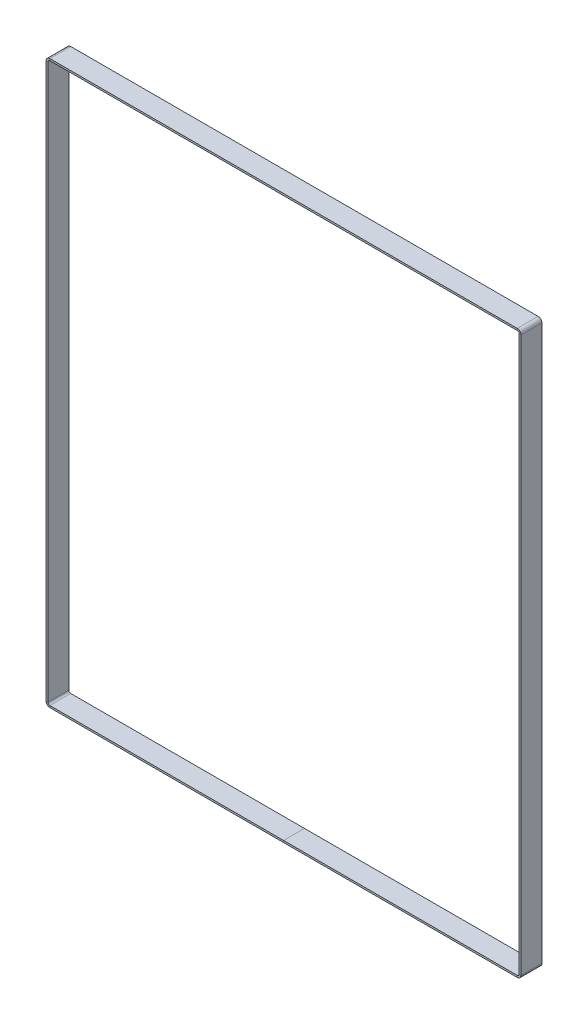
ISO-10303-21;
HEADER;
FILE_DESCRIPTION(('STEP AP214'),'2;1');
FILE_NAME('part.step','',(''),(''),'','','');
FILE_SCHEMA(('AUTOMOTIVE_DESIGN { 1 0 10303 214 1 1 1 1 }'));
ENDSEC;
DATA;
#1=APPLICATION_CONTEXT('core data for automotive mechanical design processes');
#2=APPLICATION_PROTOCOL_DEFINITION('international standard','automotive_design',2000,#1);
#3=PRODUCT_CONTEXT('',#1,'mechanical');
#4=PRODUCT('Part','Part','',(#3));
#5=PRODUCT_RELATED_PRODUCT_CATEGORY('part','',(#4));
#6=PRODUCT_DEFINITION_FORMATION('','',#4);
#7=PRODUCT_DEFINITION_CONTEXT('part definition',#1,'design');
#8=PRODUCT_DEFINITION('design','',#6,#7);
#9=PRODUCT_DEFINITION_SHAPE('','',#8);
#10=(LENGTH_UNIT() NAMED_UNIT(*) SI_UNIT(.MILLI.,.METRE.));
#11=(NAMED_UNIT(*) PLANE_ANGLE_UNIT() SI_UNIT($,.RADIAN.));
#12=(NAMED_UNIT(*) SI_UNIT($,.STERADIAN.) SOLID_ANGLE_UNIT());
#13=UNCERTAINTY_MEASURE_WITH_UNIT(LENGTH_MEASURE(1.E-05),#10,'distance_accuracy_value','');
#14=(GEOMETRIC_REPRESENTATION_CONTEXT(3) GLOBAL_UNCERTAINTY_ASSIGNED_CONTEXT((#13)) GLOBAL_UNIT_ASSIGNED_CONTEXT((#10,
#11,#12)) REPRESENTATION_CONTEXT('',''));
#15=CARTESIAN_POINT('',(0.,0.,0.));
#16=DIRECTION('',(0.,0.,1.));
#17=DIRECTION('',(1.,0.,0.));
#18=AXIS2_PLACEMENT_3D('',#15,#16,#17);
#19=CARTESIAN_POINT('',(118.212754397594,-97.4772081869041,103.673110700388));
#20=DIRECTION('',(0.,0.,-1.));
#21=DIRECTION('',(-1.,0.,0.));
#22=AXIS2_PLACEMENT_3D('',#19,#20,#21);
#23=PLANE('',#22);
#24=DIRECTION('',(1.,0.,0.));
#25=VECTOR('',#24,1.);
#26=CARTESIAN_POINT('',(118.212754397594,-98.1772081869041,103.673110700388));
#27=LINE('',#26,#25);
#28=CARTESIAN_POINT('',(118.212754397594,-98.1772081869041,103.673110700388));
#29=VERTEX_POINT('',#28);
#30=CARTESIAN_POINT('',(297.212754397594,-98.1772081869041,103.673110700388));
#31=VERTEX_POINT('',#30);
#32=EDGE_CURVE('E451',#29,#31,#27,.T.);
#33=ORIENTED_EDGE('',*,*,#32,.T.);
#34=DIRECTION('',(0.,-1.,0.));
#35=VECTOR('',#34,1.);
#36=CARTESIAN_POINT('',(297.212754397594,-97.4772081869041,103.673110700388));
#37=LINE('',#36,#35);
#38=CARTESIAN_POINT('',(297.212754397594,-97.4772081869041,103.673110700388));
#39=VERTEX_POINT('',#38);
#40=EDGE_CURVE('E120',#39,#31,#37,.T.);
#41=ORIENTED_EDGE('',*,*,#40,.F.);
#42=DIRECTION('',(1.,0.,0.));
#43=VECTOR('',#42,1.);
#44=CARTESIAN_POINT('',(118.212754397594,-97.4772081869041,103.673110700388));
#45=LINE('',#44,#43);
#46=CARTESIAN_POINT('',(118.212754397594,-97.4772081869041,103.673110700388));
#47=VERTEX_POINT('',#46);
#48=EDGE_CURVE('E439',#47,#39,#45,.T.);
#49=ORIENTED_EDGE('',*,*,#48,.F.);
#50=DIRECTION('',(0.,-1.,0.));
#51=VECTOR('',#50,1.);
#52=CARTESIAN_POINT('',(118.212754397594,-97.4772081869041,103.673110700388));
#53=LINE('',#52,#51);
#54=EDGE_CURVE('E13',#47,#29,#53,.T.);
#55=ORIENTED_EDGE('',*,*,#54,.T.);
#56=EDGE_LOOP('',(#33,#41,#49,#55));
#57=FACE_BOUND('',#56,.T.);
#58=ADVANCED_FACE('F113',(#57),#23,.F.);
#59=CARTESIAN_POINT('',(118.212754397594,-97.4772081869041,95.6731107003881));
#60=DIRECTION('',(0.,0.,1.));
#61=DIRECTION('',(1.,0.,0.));
#62=AXIS2_PLACEMENT_3D('',#59,#60,#61);
#63=PLANE('',#62);
#64=DIRECTION('',(-1.,0.,0.));
#65=VECTOR('',#64,1.);
#66=CARTESIAN_POINT('',(118.212754397594,-98.1772081869041,95.6731107003881));
#67=LINE('',#66,#65);
#68=CARTESIAN_POINT('',(297.212754397594,-98.1772081869041,95.6731107003881));
#69=VERTEX_POINT('',#68);
#70=CARTESIAN_POINT('',(118.212754397594,-98.1772081869041,95.6731107003881));
#71=VERTEX_POINT('',#70);
#72=EDGE_CURVE('E440',#69,#71,#67,.T.);
#73=ORIENTED_EDGE('',*,*,#72,.T.);
#74=DIRECTION('',(0.,-1.,0.));
#75=VECTOR('',#74,1.);
#76=CARTESIAN_POINT('',(118.212754397594,-97.4772081869041,95.6731107003881));
#77=LINE('',#76,#75);
#78=CARTESIAN_POINT('',(118.212754397594,-97.4772081869041,95.6731107003881));
#79=VERTEX_POINT('',#78);
#80=EDGE_CURVE('E449',#79,#71,#77,.T.);
#81=ORIENTED_EDGE('',*,*,#80,.F.);
#82=DIRECTION('',(-1.,0.,0.));
#83=VECTOR('',#82,1.);
#84=CARTESIAN_POINT('',(118.212754397594,-97.4772081869041,95.6731107003881));
#85=LINE('',#84,#83);
#86=CARTESIAN_POINT('',(297.212754397594,-97.4772081869041,95.6731107003881));
#87=VERTEX_POINT('',#86);
#88=EDGE_CURVE('E446',#87,#79,#85,.T.);
#89=ORIENTED_EDGE('',*,*,#88,.F.);
#90=DIRECTION('',(0.,-1.,0.));
#91=VECTOR('',#90,1.);
#92=CARTESIAN_POINT('',(297.212754397594,-97.4772081869041,95.6731107003881));
#93=LINE('',#92,#91);
#94=EDGE_CURVE('E459',#87,#69,#93,.T.);
#95=ORIENTED_EDGE('',*,*,#94,.T.);
#96=EDGE_LOOP('',(#73,#81,#89,#95));
#97=FACE_BOUND('',#96,.T.);
#98=ADVANCED_FACE('F479',(#97),#63,.F.);
#99=CARTESIAN_POINT('',(118.212754397594,-97.4772081869041,103.673110700388));
#100=DIRECTION('',(0.,1.,0.));
#101=DIRECTION('',(0.,0.,1.));
#102=AXIS2_PLACEMENT_3D('',#99,#100,#101);
#103=PLANE('',#102);
#104=DIRECTION('',(0.,0.,1.));
#105=VECTOR('',#104,1.);
#106=CARTESIAN_POINT('',(118.212754397594,-97.4772081869041,95.6731107003881));
#107=LINE('',#106,#105);
#108=EDGE_CURVE('E436',#79,#47,#107,.T.);
#109=ORIENTED_EDGE('',*,*,#108,.T.);
#110=ORIENTED_EDGE('',*,*,#48,.T.);
#111=DIRECTION('',(0.,0.,-1.));
#112=VECTOR('',#111,1.);
#113=CARTESIAN_POINT('',(297.212754397594,-97.4772081869041,95.6731107003881));
#114=LINE('',#113,#112);
#115=EDGE_CURVE('E443',#39,#87,#114,.T.);
#116=ORIENTED_EDGE('',*,*,#115,.T.);
#117=ORIENTED_EDGE('',*,*,#88,.T.);
#118=EDGE_LOOP('',(#109,#110,#116,#117));
#119=FACE_BOUND('',#118,.T.);
#120=ADVANCED_FACE('F484',(#119),#103,.T.);
#121=CARTESIAN_POINT('',(118.212754397594,-98.1772081869041,103.673110700388));
#122=DIRECTION('',(0.,1.,0.));
#123=DIRECTION('',(0.,0.,1.));
#124=AXIS2_PLACEMENT_3D('',#121,#122,#123);
#125=PLANE('',#124);
#126=DIRECTION('',(0.,0.,1.));
#127=VECTOR('',#126,1.);
#128=CARTESIAN_POINT('',(118.212754397594,-98.1772081869041,95.6731107003881));
#129=LINE('',#128,#127);
#130=EDGE_CURVE('E427',#71,#29,#129,.T.);
#131=ORIENTED_EDGE('',*,*,#130,.F.);
#132=ORIENTED_EDGE('',*,*,#72,.F.);
#133=DIRECTION('',(0.,0.,-1.));
#134=VECTOR('',#133,1.);
#135=CARTESIAN_POINT('',(297.212754397594,-98.1772081869041,95.6731107003881));
#136=LINE('',#135,#134);
#137=EDGE_CURVE('E454',#31,#69,#136,.T.);
#138=ORIENTED_EDGE('',*,*,#137,.F.);
#139=ORIENTED_EDGE('',*,*,#32,.F.);
#140=EDGE_LOOP('',(#131,#132,#138,#139));
#141=FACE_BOUND('',#140,.T.);
#142=ADVANCED_FACE('F476',(#141),#125,.F.);
#143=CARTESIAN_POINT('',(118.212754397594,-98.9138081869041,103.673110700388));
#144=DIRECTION('',(0.,0.,1.));
#145=DIRECTION('',(1.,0.,0.));
#146=AXIS2_PLACEMENT_3D('',#143,#144,#145);
#147=PLANE('',#146);
#148=DIRECTION('',(-1.,0.,0.));
#149=VECTOR('',#148,1.);
#150=CARTESIAN_POINT('',(116.776154397594,-98.9138081869041,103.673110700388));
#151=LINE('',#150,#149);
#152=CARTESIAN_POINT('',(117.476154397594,-98.9138081869041,103.673110700388));
#153=VERTEX_POINT('',#152);
#154=CARTESIAN_POINT('',(116.776154397594,-98.9138081869041,103.673110700388));
#155=VERTEX_POINT('',#154);
#156=EDGE_CURVE('E385',#153,#155,#151,.T.);
#157=ORIENTED_EDGE('',*,*,#156,.F.);
#158=CARTESIAN_POINT('',(118.212754397594,-98.9138081869041,103.673110700388));
#159=DIRECTION('',(0.,0.,-1.));
#160=DIRECTION('',(-1.,0.,0.));
#161=AXIS2_PLACEMENT_3D('',#158,#159,#160);
#162=CIRCLE('',#161,0.736600000000004);
#163=EDGE_CURVE('E431',#29,#153,#162,.F.);
#164=ORIENTED_EDGE('',*,*,#163,.F.);
#165=ORIENTED_EDGE('',*,*,#54,.F.);
#166=CARTESIAN_POINT('',(118.212754397594,-98.9138081869041,103.673110700388));
#167=DIRECTION('',(0.,0.,-1.));
#168=DIRECTION('',(-1.,0.,0.));
#169=AXIS2_PLACEMENT_3D('',#166,#167,#168);
#170=CIRCLE('',#169,1.4366);
#171=EDGE_CURVE('E135',#47,#155,#170,.F.);
#172=ORIENTED_EDGE('',*,*,#171,.T.);
#173=EDGE_LOOP('',(#157,#164,#165,#172));
#174=FACE_BOUND('',#173,.T.);
#175=ADVANCED_FACE('F526',(#174),#147,.T.);
#176=CARTESIAN_POINT('',(118.212754397594,-98.9138081869041,95.6731107003881));
#177=DIRECTION('',(0.,0.,1.));
#178=DIRECTION('',(1.,0.,0.));
#179=AXIS2_PLACEMENT_3D('',#176,#177,#178);
#180=PLANE('',#179);
#181=CARTESIAN_POINT('',(118.212754397594,-98.9138081869041,95.6731107003881));
#182=DIRECTION('',(0.,0.,-1.));
#183=DIRECTION('',(-1.,0.,0.));
#184=AXIS2_PLACEMENT_3D('',#181,#182,#183);
#185=CIRCLE('',#184,0.736600000000004);
#186=CARTESIAN_POINT('',(117.476154397594,-98.9138081869041,95.6731107003881));
#187=VERTEX_POINT('',#186);
#188=EDGE_CURVE('E397',#187,#71,#185,.T.);
#189=ORIENTED_EDGE('',*,*,#188,.F.);
#190=DIRECTION('',(-1.,0.,0.));
#191=VECTOR('',#190,1.);
#192=CARTESIAN_POINT('',(117.476154397594,-98.9138081869041,95.6731107003881));
#193=LINE('',#192,#191);
#194=CARTESIAN_POINT('',(116.776154397594,-98.9138081869041,95.6731107003881));
#195=VERTEX_POINT('',#194);
#196=EDGE_CURVE('E419',#187,#195,#193,.T.);
#197=ORIENTED_EDGE('',*,*,#196,.T.);
#198=CARTESIAN_POINT('',(118.212754397594,-98.9138081869041,95.6731107003881));
#199=DIRECTION('',(0.,0.,-1.));
#200=DIRECTION('',(-1.,0.,0.));
#201=AXIS2_PLACEMENT_3D('',#198,#199,#200);
#202=CIRCLE('',#201,1.4366);
#203=EDGE_CURVE('E428',#195,#79,#202,.T.);
#204=ORIENTED_EDGE('',*,*,#203,.T.);
#205=ORIENTED_EDGE('',*,*,#80,.T.);
#206=EDGE_LOOP('',(#189,#197,#204,#205));
#207=FACE_BOUND('',#206,.T.);
#208=ADVANCED_FACE('F528',(#207),#180,.F.);
#209=CARTESIAN_POINT('',(118.212754397594,-98.9138081869041,95.6731107003881));
#210=DIRECTION('',(0.,0.,-1.));
#211=DIRECTION('',(-1.,0.,0.));
#212=AXIS2_PLACEMENT_3D('',#209,#210,#211);
#213=CYLINDRICAL_SURFACE('',#212,1.4366);
#214=ORIENTED_EDGE('',*,*,#108,.F.);
#215=ORIENTED_EDGE('',*,*,#203,.F.);
#216=DIRECTION('',(0.,0.,-1.));
#217=VECTOR('',#216,1.);
#218=CARTESIAN_POINT('',(116.776154397594,-98.9138081869041,95.6731107003881));
#219=LINE('',#218,#217);
#220=EDGE_CURVE('E416',#155,#195,#219,.T.);
#221=ORIENTED_EDGE('',*,*,#220,.F.);
#222=ORIENTED_EDGE('',*,*,#171,.F.);
#223=EDGE_LOOP('',(#214,#215,#221,#222));
#224=FACE_BOUND('',#223,.T.);
#225=ADVANCED_FACE('F531',(#224),#213,.T.);
#226=CARTESIAN_POINT('',(118.212754397594,-98.9138081869041,95.6731107003881));
#227=DIRECTION('',(0.,0.,-1.));
#228=DIRECTION('',(-1.,0.,0.));
#229=AXIS2_PLACEMENT_3D('',#226,#227,#228);
#230=CYLINDRICAL_SURFACE('',#229,0.736600000000004);
#231=ORIENTED_EDGE('',*,*,#130,.T.);
#232=ORIENTED_EDGE('',*,*,#163,.T.);
#233=DIRECTION('',(0.,0.,1.));
#234=VECTOR('',#233,1.);
#235=CARTESIAN_POINT('',(117.476154397594,-98.9138081869041,103.673110700388));
#236=LINE('',#235,#234);
#237=EDGE_CURVE('E422',#153,#187,#236,.F.);
#238=ORIENTED_EDGE('',*,*,#237,.T.);
#239=ORIENTED_EDGE('',*,*,#188,.T.);
#240=EDGE_LOOP('',(#231,#232,#238,#239));
#241=FACE_BOUND('',#240,.T.);
#242=ADVANCED_FACE('F533',(#241),#230,.F.);
#243=CARTESIAN_POINT('',(116.776154397594,-98.1772081869041,95.6731107003881));
#244=DIRECTION('',(0.,0.,-1.));
#245=DIRECTION('',(-1.,0.,0.));
#246=AXIS2_PLACEMENT_3D('',#243,#244,#245);
#247=PLANE('',#246);
#248=DIRECTION('',(0.,1.,0.));
#249=VECTOR('',#248,1.);
#250=CARTESIAN_POINT('',(116.776154397594,-98.1772081869041,95.6731107003881));
#251=LINE('',#250,#249);
#252=CARTESIAN_POINT('',(116.776154397594,-311.317208186904,95.6731107003881));
#253=VERTEX_POINT('',#252);
#254=EDGE_CURVE('E401',#253,#195,#251,.T.);
#255=ORIENTED_EDGE('',*,*,#254,.T.);
#256=ORIENTED_EDGE('',*,*,#196,.F.);
#257=DIRECTION('',(0.,-1.,0.));
#258=VECTOR('',#257,1.);
#259=CARTESIAN_POINT('',(117.476154397594,-98.1772081869041,95.6731107003881));
#260=LINE('',#259,#258);
#261=CARTESIAN_POINT('',(117.476154397594,-311.317208186904,95.6731107003881));
#262=VERTEX_POINT('',#261);
#263=EDGE_CURVE('E409',#262,#187,#260,.F.);
#264=ORIENTED_EDGE('',*,*,#263,.F.);
#265=DIRECTION('',(1.,0.,0.));
#266=VECTOR('',#265,1.);
#267=CARTESIAN_POINT('',(116.776154397593,-311.317208186904,95.6731107003881));
#268=LINE('',#267,#266);
#269=EDGE_CURVE('E394',#253,#262,#268,.T.);
#270=ORIENTED_EDGE('',*,*,#269,.F.);
#271=EDGE_LOOP('',(#255,#256,#264,#270));
#272=FACE_BOUND('',#271,.T.);
#273=ADVANCED_FACE('F539',(#272),#247,.T.);
#274=CARTESIAN_POINT('',(116.776154397593,-311.317208186904,103.673110700388));
#275=DIRECTION('',(0.,0.,1.));
#276=DIRECTION('',(0.,-1.,0.));
#277=AXIS2_PLACEMENT_3D('',#274,#275,#276);
#278=PLANE('',#277);
#279=DIRECTION('',(0.,1.,0.));
#280=VECTOR('',#279,1.);
#281=CARTESIAN_POINT('',(117.476154397594,-98.1772081869041,103.673110700388));
#282=LINE('',#281,#280);
#283=CARTESIAN_POINT('',(117.476154397594,-311.317208186904,103.673110700388));
#284=VERTEX_POINT('',#283);
#285=EDGE_CURVE('E414',#153,#284,#282,.F.);
#286=ORIENTED_EDGE('',*,*,#285,.F.);
#287=ORIENTED_EDGE('',*,*,#156,.T.);
#288=DIRECTION('',(0.,-1.,0.));
#289=VECTOR('',#288,1.);
#290=CARTESIAN_POINT('',(116.776154397593,-311.317208186904,103.673110700388));
#291=LINE('',#290,#289);
#292=CARTESIAN_POINT('',(116.776154397593,-311.317208186904,103.673110700388));
#293=VERTEX_POINT('',#292);
#294=EDGE_CURVE('E407',#155,#293,#291,.T.);
#295=ORIENTED_EDGE('',*,*,#294,.T.);
#296=DIRECTION('',(1.,0.,0.));
#297=VECTOR('',#296,1.);
#298=CARTESIAN_POINT('',(116.776154397593,-311.317208186904,103.673110700388));
#299=LINE('',#298,#297);
#300=EDGE_CURVE('E398',#293,#284,#299,.T.);
#301=ORIENTED_EDGE('',*,*,#300,.T.);
#302=EDGE_LOOP('',(#286,#287,#295,#301));
#303=FACE_BOUND('',#302,.T.);
#304=ADVANCED_FACE('F543',(#303),#278,.T.);
#305=CARTESIAN_POINT('',(116.776154397594,-98.1772081869041,95.6731107003881));
#306=DIRECTION('',(-1.,0.,0.));
#307=DIRECTION('',(0.,-1.,0.));
#308=AXIS2_PLACEMENT_3D('',#305,#306,#307);
#309=PLANE('',#308);
#310=ORIENTED_EDGE('',*,*,#294,.F.);
#311=ORIENTED_EDGE('',*,*,#220,.T.);
#312=ORIENTED_EDGE('',*,*,#254,.F.);
#313=DIRECTION('',(0.,0.,-1.));
#314=VECTOR('',#313,1.);
#315=CARTESIAN_POINT('',(116.776154397593,-311.317208186904,95.6731107003881));
#316=LINE('',#315,#314);
#317=EDGE_CURVE('E404',#293,#253,#316,.T.);
#318=ORIENTED_EDGE('',*,*,#317,.F.);
#319=EDGE_LOOP('',(#310,#311,#312,#318));
#320=FACE_BOUND('',#319,.T.);
#321=ADVANCED_FACE('F546',(#320),#309,.T.);
#322=CARTESIAN_POINT('',(117.476154397594,-98.1772081869041,95.6731107003881));
#323=DIRECTION('',(-1.,0.,0.));
#324=DIRECTION('',(0.,-1.,0.));
#325=AXIS2_PLACEMENT_3D('',#322,#323,#324);
#326=PLANE('',#325);
#327=ORIENTED_EDGE('',*,*,#237,.F.);
#328=ORIENTED_EDGE('',*,*,#285,.T.);
#329=DIRECTION('',(0.,0.,1.));
#330=VECTOR('',#329,1.);
#331=CARTESIAN_POINT('',(117.476154397594,-311.317208186904,95.6731107003881));
#332=LINE('',#331,#330);
#333=EDGE_CURVE('E412',#284,#262,#332,.F.);
#334=ORIENTED_EDGE('',*,*,#333,.T.);
#335=ORIENTED_EDGE('',*,*,#263,.T.);
#336=EDGE_LOOP('',(#327,#328,#334,#335));
#337=FACE_BOUND('',#336,.T.);
#338=ADVANCED_FACE('F551',(#337),#326,.F.);
#339=CARTESIAN_POINT('',(297.212754397594,-98.913808186904,95.6731107003881));
#340=DIRECTION('',(0.,0.,-1.));
#341=DIRECTION('',(-1.,0.,0.));
#342=AXIS2_PLACEMENT_3D('',#339,#340,#341);
#343=PLANE('',#342);
#344=DIRECTION('',(1.,0.,0.));
#345=VECTOR('',#344,1.);
#346=CARTESIAN_POINT('',(298.649354397594,-98.913808186904,95.6731107003881));
#347=LINE('',#346,#345);
#348=CARTESIAN_POINT('',(297.949354397594,-98.913808186904,95.6731107003881));
#349=VERTEX_POINT('',#348);
#350=CARTESIAN_POINT('',(298.649354397594,-98.913808186904,95.6731107003881));
#351=VERTEX_POINT('',#350);
#352=EDGE_CURVE('E346',#349,#351,#347,.T.);
#353=ORIENTED_EDGE('',*,*,#352,.F.);
#354=CARTESIAN_POINT('',(297.212754397594,-98.913808186904,95.6731107003881));
#355=DIRECTION('',(0.,0.,1.));
#356=DIRECTION('',(1.,0.,0.));
#357=AXIS2_PLACEMENT_3D('',#354,#355,#356);
#358=CIRCLE('',#357,0.736599999999976);
#359=EDGE_CURVE('E389',#69,#349,#358,.F.);
#360=ORIENTED_EDGE('',*,*,#359,.F.);
#361=ORIENTED_EDGE('',*,*,#94,.F.);
#362=CARTESIAN_POINT('',(297.212754397594,-98.913808186904,95.6731107003881));
#363=DIRECTION('',(0.,0.,1.));
#364=DIRECTION('',(1.,0.,0.));
#365=AXIS2_PLACEMENT_3D('',#362,#363,#364);
#366=CIRCLE('',#365,1.43659999999998);
#367=EDGE_CURVE('E127',#87,#351,#366,.F.);
#368=ORIENTED_EDGE('',*,*,#367,.T.);
#369=EDGE_LOOP('',(#353,#360,#361,#368));
#370=FACE_BOUND('',#369,.T.);
#371=ADVANCED_FACE('F482',(#370),#343,.T.);
#372=CARTESIAN_POINT('',(297.212754397594,-98.913808186904,103.673110700388));
#373=DIRECTION('',(0.,0.,-1.));
#374=DIRECTION('',(-1.,0.,0.));
#375=AXIS2_PLACEMENT_3D('',#372,#373,#374);
#376=PLANE('',#375);
#377=CARTESIAN_POINT('',(297.212754397594,-98.913808186904,103.673110700388));
#378=DIRECTION('',(0.,0.,1.));
#379=DIRECTION('',(1.,0.,0.));
#380=AXIS2_PLACEMENT_3D('',#377,#378,#379);
#381=CIRCLE('',#380,0.736599999999976);
#382=CARTESIAN_POINT('',(297.949354397594,-98.913808186904,103.673110700388));
#383=VERTEX_POINT('',#382);
#384=EDGE_CURVE('E357',#383,#31,#381,.T.);
#385=ORIENTED_EDGE('',*,*,#384,.F.);
#386=DIRECTION('',(1.,0.,0.));
#387=VECTOR('',#386,1.);
#388=CARTESIAN_POINT('',(297.949354397594,-98.913808186904,103.673110700388));
#389=LINE('',#388,#387);
#390=CARTESIAN_POINT('',(298.649354397594,-98.913808186904,103.673110700388));
#391=VERTEX_POINT('',#390);
#392=EDGE_CURVE('E377',#383,#391,#389,.T.);
#393=ORIENTED_EDGE('',*,*,#392,.T.);
#394=CARTESIAN_POINT('',(297.212754397594,-98.913808186904,103.673110700388));
#395=DIRECTION('',(0.,0.,1.));
#396=DIRECTION('',(1.,0.,0.));
#397=AXIS2_PLACEMENT_3D('',#394,#395,#396);
#398=CIRCLE('',#397,1.43659999999998);
#399=EDGE_CURVE('E386',#391,#39,#398,.T.);
#400=ORIENTED_EDGE('',*,*,#399,.T.);
#401=ORIENTED_EDGE('',*,*,#40,.T.);
#402=EDGE_LOOP('',(#385,#393,#400,#401));
#403=FACE_BOUND('',#402,.T.);
#404=ADVANCED_FACE('F464',(#403),#376,.F.);
#405=CARTESIAN_POINT('',(297.212754397594,-98.913808186904,103.673110700388));
#406=DIRECTION('',(0.,0.,1.));
#407=DIRECTION('',(1.,0.,0.));
#408=AXIS2_PLACEMENT_3D('',#405,#406,#407);
#409=CYLINDRICAL_SURFACE('',#408,1.43659999999998);
#410=ORIENTED_EDGE('',*,*,#115,.F.);
#411=ORIENTED_EDGE('',*,*,#399,.F.);
#412=DIRECTION('',(0.,0.,1.));
#413=VECTOR('',#412,1.);
#414=CARTESIAN_POINT('',(298.649354397594,-98.913808186904,103.673110700388));
#415=LINE('',#414,#413);
#416=EDGE_CURVE('E374',#351,#391,#415,.T.);
#417=ORIENTED_EDGE('',*,*,#416,.F.);
#418=ORIENTED_EDGE('',*,*,#367,.F.);
#419=EDGE_LOOP('',(#410,#411,#417,#418));
#420=FACE_BOUND('',#419,.T.);
#421=ADVANCED_FACE('F485',(#420),#409,.T.);
#422=CARTESIAN_POINT('',(297.212754397594,-98.913808186904,103.673110700388));
#423=DIRECTION('',(0.,0.,1.));
#424=DIRECTION('',(1.,0.,0.));
#425=AXIS2_PLACEMENT_3D('',#422,#423,#424);
#426=CYLINDRICAL_SURFACE('',#425,0.736599999999976);
#427=ORIENTED_EDGE('',*,*,#137,.T.);
#428=ORIENTED_EDGE('',*,*,#359,.T.);
#429=DIRECTION('',(0.,0.,-1.));
#430=VECTOR('',#429,1.);
#431=CARTESIAN_POINT('',(297.949354397594,-98.913808186904,95.6731107003881));
#432=LINE('',#431,#430);
#433=EDGE_CURVE('E380',#349,#383,#432,.F.);
#434=ORIENTED_EDGE('',*,*,#433,.T.);
#435=ORIENTED_EDGE('',*,*,#384,.T.);
#436=EDGE_LOOP('',(#427,#428,#434,#435));
#437=FACE_BOUND('',#436,.T.);
#438=ADVANCED_FACE('F468',(#437),#426,.F.);
#439=CARTESIAN_POINT('',(298.649354397594,-98.1772081869041,103.673110700388));
#440=DIRECTION('',(0.,0.,1.));
#441=DIRECTION('',(1.,0.,0.));
#442=AXIS2_PLACEMENT_3D('',#439,#440,#441);
#443=PLANE('',#442);
#444=DIRECTION('',(0.,1.,0.));
#445=VECTOR('',#444,1.);
#446=CARTESIAN_POINT('',(298.649354397594,-98.1772081869041,103.673110700388));
#447=LINE('',#446,#445);
#448=CARTESIAN_POINT('',(298.649354397595,-311.317208186904,103.673110700388));
#449=VERTEX_POINT('',#448);
#450=EDGE_CURVE('E361',#449,#391,#447,.T.);
#451=ORIENTED_EDGE('',*,*,#450,.T.);
#452=ORIENTED_EDGE('',*,*,#392,.F.);
#453=DIRECTION('',(0.,-1.,0.));
#454=VECTOR('',#453,1.);
#455=CARTESIAN_POINT('',(297.949354397594,-98.1772081869041,103.673110700388));
#456=LINE('',#455,#454);
#457=CARTESIAN_POINT('',(297.949354397595,-311.317208186904,103.673110700388));
#458=VERTEX_POINT('',#457);
#459=EDGE_CURVE('E367',#458,#383,#456,.F.);
#460=ORIENTED_EDGE('',*,*,#459,.F.);
#461=DIRECTION('',(-1.,0.,0.));
#462=VECTOR('',#461,1.);
#463=CARTESIAN_POINT('',(298.649354397595,-311.317208186904,103.673110700388));
#464=LINE('',#463,#462);
#465=EDGE_CURVE('E355',#449,#458,#464,.T.);
#466=ORIENTED_EDGE('',*,*,#465,.F.);
#467=EDGE_LOOP('',(#451,#452,#460,#466));
#468=FACE_BOUND('',#467,.T.);
#469=ADVANCED_FACE('F493',(#468),#443,.T.);
#470=CARTESIAN_POINT('',(298.649354397595,-311.317208186904,95.6731107003881));
#471=DIRECTION('',(0.,0.,-1.));
#472=DIRECTION('',(0.,1.,0.));
#473=AXIS2_PLACEMENT_3D('',#470,#471,#472);
#474=PLANE('',#473);
#475=DIRECTION('',(0.,1.,0.));
#476=VECTOR('',#475,1.);
#477=CARTESIAN_POINT('',(297.949354397594,-98.1772081869041,95.6731107003881));
#478=LINE('',#477,#476);
#479=CARTESIAN_POINT('',(297.949354397595,-311.317208186904,95.6731107003881));
#480=VERTEX_POINT('',#479);
#481=EDGE_CURVE('E372',#349,#480,#478,.F.);
#482=ORIENTED_EDGE('',*,*,#481,.F.);
#483=ORIENTED_EDGE('',*,*,#352,.T.);
#484=DIRECTION('',(0.,-1.,0.));
#485=VECTOR('',#484,1.);
#486=CARTESIAN_POINT('',(298.649354397595,-311.317208186904,95.6731107003881));
#487=LINE('',#486,#485);
#488=CARTESIAN_POINT('',(298.649354397595,-311.317208186904,95.6731107003881));
#489=VERTEX_POINT('',#488);
#490=EDGE_CURVE('E365',#351,#489,#487,.T.);
#491=ORIENTED_EDGE('',*,*,#490,.T.);
#492=DIRECTION('',(-1.,0.,0.));
#493=VECTOR('',#492,1.);
#494=CARTESIAN_POINT('',(298.649354397595,-311.317208186904,95.6731107003881));
#495=LINE('',#494,#493);
#496=EDGE_CURVE('E358',#489,#480,#495,.T.);
#497=ORIENTED_EDGE('',*,*,#496,.T.);
#498=EDGE_LOOP('',(#482,#483,#491,#497));
#499=FACE_BOUND('',#498,.T.);
#500=ADVANCED_FACE('F566',(#499),#474,.T.);
#501=CARTESIAN_POINT('',(298.649354397594,-98.1772081869041,103.673110700388));
#502=DIRECTION('',(1.,0.,0.));
#503=DIRECTION('',(0.,1.,0.));
#504=AXIS2_PLACEMENT_3D('',#501,#502,#503);
#505=PLANE('',#504);
#506=ORIENTED_EDGE('',*,*,#490,.F.);
#507=ORIENTED_EDGE('',*,*,#416,.T.);
#508=ORIENTED_EDGE('',*,*,#450,.F.);
#509=DIRECTION('',(0.,0.,1.));
#510=VECTOR('',#509,1.);
#511=CARTESIAN_POINT('',(298.649354397595,-311.317208186904,103.673110700388));
#512=LINE('',#511,#510);
#513=EDGE_CURVE('E257',#489,#449,#512,.T.);
#514=ORIENTED_EDGE('',*,*,#513,.F.);
#515=EDGE_LOOP('',(#506,#507,#508,#514));
#516=FACE_BOUND('',#515,.T.);
#517=ADVANCED_FACE('F491',(#516),#505,.T.);
#518=CARTESIAN_POINT('',(297.949354397594,-98.1772081869041,103.673110700388));
#519=DIRECTION('',(1.,0.,0.));
#520=DIRECTION('',(0.,1.,0.));
#521=AXIS2_PLACEMENT_3D('',#518,#519,#520);
#522=PLANE('',#521);
#523=ORIENTED_EDGE('',*,*,#433,.F.);
#524=ORIENTED_EDGE('',*,*,#481,.T.);
#525=DIRECTION('',(0.,0.,-1.));
#526=VECTOR('',#525,1.);
#527=CARTESIAN_POINT('',(297.949354397595,-311.317208186904,103.673110700388));
#528=LINE('',#527,#526);
#529=EDGE_CURVE('E370',#480,#458,#528,.F.);
#530=ORIENTED_EDGE('',*,*,#529,.T.);
#531=ORIENTED_EDGE('',*,*,#459,.T.);
#532=EDGE_LOOP('',(#523,#524,#530,#531));
#533=FACE_BOUND('',#532,.T.);
#534=ADVANCED_FACE('F572',(#533),#522,.F.);
#535=CARTESIAN_POINT('',(118.212754397593,-311.317208186904,103.673110700388));
#536=DIRECTION('',(0.,0.,1.));
#537=DIRECTION('',(1.,0.,0.));
#538=AXIS2_PLACEMENT_3D('',#535,#536,#537);
#539=PLANE('',#538);
#540=DIRECTION('',(0.,-1.,0.));
#541=VECTOR('',#540,1.);
#542=CARTESIAN_POINT('',(118.212754397593,-312.753808186904,103.673110700388));
#543=LINE('',#542,#541);
#544=CARTESIAN_POINT('',(118.212754397593,-312.053808186904,103.673110700388));
#545=VERTEX_POINT('',#544);
#546=CARTESIAN_POINT('',(118.212754397593,-312.753808186904,103.673110700388));
#547=VERTEX_POINT('',#546);
#548=EDGE_CURVE('E306',#545,#547,#543,.T.);
#549=ORIENTED_EDGE('',*,*,#548,.F.);
#550=CARTESIAN_POINT('',(118.212754397593,-311.317208186904,103.673110700388));
#551=DIRECTION('',(0.,0.,-1.));
#552=DIRECTION('',(-1.,0.,0.));
#553=AXIS2_PLACEMENT_3D('',#550,#551,#552);
#554=CIRCLE('',#553,0.736599999999976);
#555=EDGE_CURVE('E350',#284,#545,#554,.F.);
#556=ORIENTED_EDGE('',*,*,#555,.F.);
#557=ORIENTED_EDGE('',*,*,#300,.F.);
#558=CARTESIAN_POINT('',(118.212754397593,-311.317208186904,103.673110700388));
#559=DIRECTION('',(0.,0.,-1.));
#560=DIRECTION('',(-1.,0.,0.));
#561=AXIS2_PLACEMENT_3D('',#558,#559,#560);
#562=CIRCLE('',#561,1.43659999999998);
#563=EDGE_CURVE('E343',#293,#547,#562,.F.);
#564=ORIENTED_EDGE('',*,*,#563,.T.);
#565=EDGE_LOOP('',(#549,#556,#557,#564));
#566=FACE_BOUND('',#565,.T.);
#567=ADVANCED_FACE('F575',(#566),#539,.T.);
#568=CARTESIAN_POINT('',(118.212754397593,-311.317208186904,95.6731107003881));
#569=DIRECTION('',(0.,0.,1.));
#570=DIRECTION('',(1.,0.,0.));
#571=AXIS2_PLACEMENT_3D('',#568,#569,#570);
#572=PLANE('',#571);
#573=CARTESIAN_POINT('',(118.212754397593,-311.317208186904,95.6731107003881));
#574=DIRECTION('',(0.,0.,-1.));
#575=DIRECTION('',(-1.,0.,0.));
#576=AXIS2_PLACEMENT_3D('',#573,#574,#575);
#577=CIRCLE('',#576,0.736599999999976);
#578=CARTESIAN_POINT('',(118.212754397593,-312.053808186904,95.6731107003881));
#579=VERTEX_POINT('',#578);
#580=EDGE_CURVE('E313',#579,#262,#577,.T.);
#581=ORIENTED_EDGE('',*,*,#580,.F.);
#582=DIRECTION('',(0.,-1.,0.));
#583=VECTOR('',#582,1.);
#584=CARTESIAN_POINT('',(118.212754397593,-312.053808186904,95.6731107003881));
#585=LINE('',#584,#583);
#586=CARTESIAN_POINT('',(118.212754397593,-312.753808186904,95.6731107003881));
#587=VERTEX_POINT('',#586);
#588=EDGE_CURVE('E336',#579,#587,#585,.T.);
#589=ORIENTED_EDGE('',*,*,#588,.T.);
#590=CARTESIAN_POINT('',(118.212754397593,-311.317208186904,95.6731107003881));
#591=DIRECTION('',(0.,0.,-1.));
#592=DIRECTION('',(-1.,0.,0.));
#593=AXIS2_PLACEMENT_3D('',#590,#591,#592);
#594=CIRCLE('',#593,1.43659999999998);
#595=EDGE_CURVE('E347',#587,#253,#594,.T.);
#596=ORIENTED_EDGE('',*,*,#595,.T.);
#597=ORIENTED_EDGE('',*,*,#269,.T.);
#598=EDGE_LOOP('',(#581,#589,#596,#597));
#599=FACE_BOUND('',#598,.T.);
#600=ADVANCED_FACE('F579',(#599),#572,.F.);
#601=CARTESIAN_POINT('',(118.212754397593,-311.317208186904,95.6731107003881));
#602=DIRECTION('',(0.,0.,-1.));
#603=DIRECTION('',(0.,-1.,0.));
#604=AXIS2_PLACEMENT_3D('',#601,#602,#603);
#605=CYLINDRICAL_SURFACE('',#604,1.43659999999998);
#606=ORIENTED_EDGE('',*,*,#317,.T.);
#607=ORIENTED_EDGE('',*,*,#595,.F.);
#608=DIRECTION('',(0.,0.,-1.));
#609=VECTOR('',#608,1.);
#610=CARTESIAN_POINT('',(118.212754397593,-312.753808186904,95.6731107003881));
#611=LINE('',#610,#609);
#612=EDGE_CURVE('E333',#547,#587,#611,.T.);
#613=ORIENTED_EDGE('',*,*,#612,.F.);
#614=ORIENTED_EDGE('',*,*,#563,.F.);
#615=EDGE_LOOP('',(#606,#607,#613,#614));
#616=FACE_BOUND('',#615,.T.);
#617=ADVANCED_FACE('F582',(#616),#605,.T.);
#618=CARTESIAN_POINT('',(118.212754397593,-311.317208186904,95.6731107003881));
#619=DIRECTION('',(0.,0.,-1.));
#620=DIRECTION('',(0.,-1.,0.));
#621=AXIS2_PLACEMENT_3D('',#618,#619,#620);
#622=CYLINDRICAL_SURFACE('',#621,0.736599999999976);
#623=ORIENTED_EDGE('',*,*,#333,.F.);
#624=ORIENTED_EDGE('',*,*,#555,.T.);
#625=DIRECTION('',(0.,0.,1.));
#626=VECTOR('',#625,1.);
#627=CARTESIAN_POINT('',(118.212754397593,-312.053808186904,103.673110700388));
#628=LINE('',#627,#626);
#629=EDGE_CURVE('E339',#545,#579,#628,.F.);
#630=ORIENTED_EDGE('',*,*,#629,.T.);
#631=ORIENTED_EDGE('',*,*,#580,.T.);
#632=EDGE_LOOP('',(#623,#624,#630,#631));
#633=FACE_BOUND('',#632,.T.);
#634=ADVANCED_FACE('F584',(#633),#622,.F.);
#635=CARTESIAN_POINT('',(117.476154397594,-312.753808186904,95.6731107003881));
#636=DIRECTION('',(0.,0.,-1.));
#637=DIRECTION('',(-1.,0.,0.));
#638=AXIS2_PLACEMENT_3D('',#635,#636,#637);
#639=PLANE('',#638);
#640=DIRECTION('',(-1.,0.,0.));
#641=VECTOR('',#640,1.);
#642=CARTESIAN_POINT('',(117.476154397594,-312.753808186904,95.6731107003881));
#643=LINE('',#642,#641);
#644=CARTESIAN_POINT('',(207.711154397594,-312.753808186905,95.6731107003881));
#645=VERTEX_POINT('',#644);
#646=EDGE_CURVE('E317',#645,#587,#643,.T.);
#647=ORIENTED_EDGE('',*,*,#646,.T.);
#648=ORIENTED_EDGE('',*,*,#588,.F.);
#649=DIRECTION('',(1.,0.,0.));
#650=VECTOR('',#649,1.);
#651=CARTESIAN_POINT('',(117.476154397594,-312.053808186904,95.6731107003881));
#652=LINE('',#651,#650);
#653=CARTESIAN_POINT('',(207.711154397594,-312.053808186905,95.6731107003881));
#654=VERTEX_POINT('',#653);
#655=EDGE_CURVE('E325',#654,#579,#652,.F.);
#656=ORIENTED_EDGE('',*,*,#655,.F.);
#657=DIRECTION('',(0.,1.,0.));
#658=VECTOR('',#657,1.);
#659=CARTESIAN_POINT('',(207.711154397594,-312.753808186905,95.6731107003881));
#660=LINE('',#659,#658);
#661=EDGE_CURVE('E311',#645,#654,#660,.T.);
#662=ORIENTED_EDGE('',*,*,#661,.F.);
#663=EDGE_LOOP('',(#647,#648,#656,#662));
#664=FACE_BOUND('',#663,.T.);
#665=ADVANCED_FACE('F590',(#664),#639,.T.);
#666=CARTESIAN_POINT('',(207.711154397594,-312.753808186905,103.673110700388));
#667=DIRECTION('',(0.,0.,1.));
#668=DIRECTION('',(1.,0.,0.));
#669=AXIS2_PLACEMENT_3D('',#666,#667,#668);
#670=PLANE('',#669);
#671=DIRECTION('',(-1.,0.,0.));
#672=VECTOR('',#671,1.);
#673=CARTESIAN_POINT('',(117.476154397594,-312.053808186904,103.673110700388));
#674=LINE('',#673,#672);
#675=CARTESIAN_POINT('',(207.711154397594,-312.053808186905,103.673110700388));
#676=VERTEX_POINT('',#675);
#677=EDGE_CURVE('E331',#545,#676,#674,.F.);
#678=ORIENTED_EDGE('',*,*,#677,.F.);
#679=ORIENTED_EDGE('',*,*,#548,.T.);
#680=DIRECTION('',(1.,0.,0.));
#681=VECTOR('',#680,1.);
#682=CARTESIAN_POINT('',(207.711154397594,-312.753808186905,103.673110700388));
#683=LINE('',#682,#681);
#684=CARTESIAN_POINT('',(207.711154397594,-312.753808186905,103.673110700388));
#685=VERTEX_POINT('',#684);
#686=EDGE_CURVE('E323',#547,#685,#683,.T.);
#687=ORIENTED_EDGE('',*,*,#686,.T.);
#688=DIRECTION('',(0.,1.,0.));
#689=VECTOR('',#688,1.);
#690=CARTESIAN_POINT('',(207.711154397594,-312.753808186905,103.673110700388));
#691=LINE('',#690,#689);
#692=EDGE_CURVE('E314',#685,#676,#691,.T.);
#693=ORIENTED_EDGE('',*,*,#692,.T.);
#694=EDGE_LOOP('',(#678,#679,#687,#693));
#695=FACE_BOUND('',#694,.T.);
#696=ADVANCED_FACE('F595',(#695),#670,.T.);
#697=CARTESIAN_POINT('',(117.476154397594,-312.753808186904,95.6731107003881));
#698=DIRECTION('',(0.,-1.,0.));
#699=DIRECTION('',(1.,0.,0.));
#700=AXIS2_PLACEMENT_3D('',#697,#698,#699);
#701=PLANE('',#700);
#702=ORIENTED_EDGE('',*,*,#686,.F.);
#703=ORIENTED_EDGE('',*,*,#612,.T.);
#704=ORIENTED_EDGE('',*,*,#646,.F.);
#705=DIRECTION('',(0.,0.,-1.));
#706=VECTOR('',#705,1.);
#707=CARTESIAN_POINT('',(207.711154397594,-312.753808186905,95.6731107003881));
#708=LINE('',#707,#706);
#709=EDGE_CURVE('E320',#685,#645,#708,.T.);
#710=ORIENTED_EDGE('',*,*,#709,.F.);
#711=EDGE_LOOP('',(#702,#703,#704,#710));
#712=FACE_BOUND('',#711,.T.);
#713=ADVANCED_FACE('F598',(#712),#701,.T.);
#714=CARTESIAN_POINT('',(117.476154397594,-312.053808186904,95.6731107003881));
#715=DIRECTION('',(0.,-1.,0.));
#716=DIRECTION('',(1.,0.,0.));
#717=AXIS2_PLACEMENT_3D('',#714,#715,#716);
#718=PLANE('',#717);
#719=ORIENTED_EDGE('',*,*,#629,.F.);
#720=ORIENTED_EDGE('',*,*,#677,.T.);
#721=DIRECTION('',(0.,0.,1.));
#722=VECTOR('',#721,1.);
#723=CARTESIAN_POINT('',(207.711154397594,-312.053808186905,95.6731107003881));
#724=LINE('',#723,#722);
#725=EDGE_CURVE('E328',#676,#654,#724,.F.);
#726=ORIENTED_EDGE('',*,*,#725,.T.);
#727=ORIENTED_EDGE('',*,*,#655,.T.);
#728=EDGE_LOOP('',(#719,#720,#726,#727));
#729=FACE_BOUND('',#728,.T.);
#730=ADVANCED_FACE('F604',(#729),#718,.F.);
#731=CARTESIAN_POINT('',(207.711154397594,-312.753808186905,95.6731107003881));
#732=DIRECTION('',(1.,0.,0.));
#733=DIRECTION('',(0.,1.,0.));
#734=AXIS2_PLACEMENT_3D('',#731,#732,#733);
#735=PLANE('',#734);
#736=ORIENTED_EDGE('',*,*,#725,.F.);
#737=ORIENTED_EDGE('',*,*,#692,.F.);
#738=ORIENTED_EDGE('',*,*,#709,.T.);
#739=ORIENTED_EDGE('',*,*,#661,.T.);
#740=EDGE_LOOP('',(#736,#737,#738,#739));
#741=FACE_BOUND('',#740,.T.);
#742=ADVANCED_FACE('F600',(#741),#735,.T.);
#743=CARTESIAN_POINT('',(297.212754397595,-311.317208186904,95.6731107003881));
#744=DIRECTION('',(0.,0.,-1.));
#745=DIRECTION('',(-1.,0.,0.));
#746=AXIS2_PLACEMENT_3D('',#743,#744,#745);
#747=PLANE('',#746);
#748=DIRECTION('',(0.,-1.,0.));
#749=VECTOR('',#748,1.);
#750=CARTESIAN_POINT('',(297.212754397595,-312.753808186904,95.6731107003881));
#751=LINE('',#750,#749);
#752=CARTESIAN_POINT('',(297.212754397595,-312.053808186904,95.6731107003881));
#753=VERTEX_POINT('',#752);
#754=CARTESIAN_POINT('',(297.212754397595,-312.753808186904,95.6731107003881));
#755=VERTEX_POINT('',#754);
#756=EDGE_CURVE('E303',#753,#755,#751,.T.);
#757=ORIENTED_EDGE('',*,*,#756,.F.);
#758=CARTESIAN_POINT('',(297.212754397595,-311.317208186904,95.6731107003881));
#759=DIRECTION('',(0.,0.,1.));
#760=DIRECTION('',(1.,0.,0.));
#761=AXIS2_PLACEMENT_3D('',#758,#759,#760);
#762=CIRCLE('',#761,0.736599999999976);
#763=EDGE_CURVE('E261',#480,#753,#762,.F.);
#764=ORIENTED_EDGE('',*,*,#763,.F.);
#765=ORIENTED_EDGE('',*,*,#496,.F.);
#766=CARTESIAN_POINT('',(297.212754397595,-311.317208186904,95.6731107003881));
#767=DIRECTION('',(0.,0.,1.));
#768=DIRECTION('',(1.,0.,0.));
#769=AXIS2_PLACEMENT_3D('',#766,#767,#768);
#770=CIRCLE('',#769,1.43659999999998);
#771=EDGE_CURVE('E260',#489,#755,#770,.F.);
#772=ORIENTED_EDGE('',*,*,#771,.T.);
#773=EDGE_LOOP('',(#757,#764,#765,#772));
#774=FACE_BOUND('',#773,.T.);
#775=ADVANCED_FACE('F603',(#774),#747,.T.);
#776=CARTESIAN_POINT('',(297.212754397595,-311.317208186904,103.673110700388));
#777=DIRECTION('',(0.,0.,-1.));
#778=DIRECTION('',(-1.,0.,0.));
#779=AXIS2_PLACEMENT_3D('',#776,#777,#778);
#780=PLANE('',#779);
#781=CARTESIAN_POINT('',(297.212754397595,-311.317208186904,103.673110700388));
#782=DIRECTION('',(0.,0.,1.));
#783=DIRECTION('',(1.,0.,0.));
#784=AXIS2_PLACEMENT_3D('',#781,#782,#783);
#785=CIRCLE('',#784,0.736599999999976);
#786=CARTESIAN_POINT('',(297.212754397595,-312.053808186904,103.673110700388));
#787=VERTEX_POINT('',#786);
#788=EDGE_CURVE('E268',#787,#458,#785,.T.);
#789=ORIENTED_EDGE('',*,*,#788,.F.);
#790=DIRECTION('',(0.,-1.,0.));
#791=VECTOR('',#790,1.);
#792=CARTESIAN_POINT('',(297.212754397595,-312.053808186904,103.673110700388));
#793=LINE('',#792,#791);
#794=CARTESIAN_POINT('',(297.212754397595,-312.753808186904,103.673110700388));
#795=VERTEX_POINT('',#794);
#796=EDGE_CURVE('E265',#787,#795,#793,.T.);
#797=ORIENTED_EDGE('',*,*,#796,.T.);
#798=CARTESIAN_POINT('',(297.212754397595,-311.317208186904,103.673110700388));
#799=DIRECTION('',(0.,0.,1.));
#800=DIRECTION('',(1.,0.,0.));
#801=AXIS2_PLACEMENT_3D('',#798,#799,#800);
#802=CIRCLE('',#801,1.43659999999998);
#803=EDGE_CURVE('E249',#795,#449,#802,.T.);
#804=ORIENTED_EDGE('',*,*,#803,.T.);
#805=ORIENTED_EDGE('',*,*,#465,.T.);
#806=EDGE_LOOP('',(#789,#797,#804,#805));
#807=FACE_BOUND('',#806,.T.);
#808=ADVANCED_FACE('F266',(#807),#780,.F.);
#809=CARTESIAN_POINT('',(297.212754397595,-311.317208186904,103.673110700388));
#810=DIRECTION('',(0.,0.,1.));
#811=DIRECTION('',(0.,-1.,0.));
#812=AXIS2_PLACEMENT_3D('',#809,#810,#811);
#813=CYLINDRICAL_SURFACE('',#812,1.43659999999998);
#814=ORIENTED_EDGE('',*,*,#513,.T.);
#815=ORIENTED_EDGE('',*,*,#803,.F.);
#816=DIRECTION('',(0.,0.,1.));
#817=VECTOR('',#816,1.);
#818=CARTESIAN_POINT('',(297.212754397595,-312.753808186904,103.673110700388));
#819=LINE('',#818,#817);
#820=EDGE_CURVE('E254',#755,#795,#819,.T.);
#821=ORIENTED_EDGE('',*,*,#820,.F.);
#822=ORIENTED_EDGE('',*,*,#771,.F.);
#823=EDGE_LOOP('',(#814,#815,#821,#822));
#824=FACE_BOUND('',#823,.T.);
#825=ADVANCED_FACE('F251',(#824),#813,.T.);
#826=CARTESIAN_POINT('',(297.212754397595,-311.317208186904,103.673110700388));
#827=DIRECTION('',(0.,0.,1.));
#828=DIRECTION('',(0.,-1.,0.));
#829=AXIS2_PLACEMENT_3D('',#826,#827,#828);
#830=CYLINDRICAL_SURFACE('',#829,0.736599999999976);
#831=ORIENTED_EDGE('',*,*,#529,.F.);
#832=ORIENTED_EDGE('',*,*,#763,.T.);
#833=DIRECTION('',(0.,0.,-1.));
#834=VECTOR('',#833,1.);
#835=CARTESIAN_POINT('',(297.212754397595,-312.053808186904,95.6731107003881));
#836=LINE('',#835,#834);
#837=EDGE_CURVE('E273',#753,#787,#836,.F.);
#838=ORIENTED_EDGE('',*,*,#837,.T.);
#839=ORIENTED_EDGE('',*,*,#788,.T.);
#840=EDGE_LOOP('',(#831,#832,#838,#839));
#841=FACE_BOUND('',#840,.T.);
#842=ADVANCED_FACE('F496',(#841),#830,.F.);
#843=CARTESIAN_POINT('',(297.949354397595,-312.753808186904,103.673110700388));
#844=DIRECTION('',(0.,0.,1.));
#845=DIRECTION('',(1.,0.,0.));
#846=AXIS2_PLACEMENT_3D('',#843,#844,#845);
#847=PLANE('',#846);
#848=DIRECTION('',(1.,0.,0.));
#849=VECTOR('',#848,1.);
#850=CARTESIAN_POINT('',(297.949354397595,-312.753808186904,103.673110700388));
#851=LINE('',#850,#849);
#852=CARTESIAN_POINT('',(207.714354397595,-312.753808186905,103.673110700388));
#853=VERTEX_POINT('',#852);
#854=EDGE_CURVE('E280',#853,#795,#851,.T.);
#855=ORIENTED_EDGE('',*,*,#854,.T.);
#856=ORIENTED_EDGE('',*,*,#796,.F.);
#857=DIRECTION('',(-1.,0.,0.));
#858=VECTOR('',#857,1.);
#859=CARTESIAN_POINT('',(297.949354397595,-312.053808186904,103.673110700388));
#860=LINE('',#859,#858);
#861=CARTESIAN_POINT('',(207.714354397595,-312.053808186905,103.673110700388));
#862=VERTEX_POINT('',#861);
#863=EDGE_CURVE('E296',#862,#787,#860,.F.);
#864=ORIENTED_EDGE('',*,*,#863,.F.);
#865=DIRECTION('',(0.,1.,0.));
#866=VECTOR('',#865,1.);
#867=CARTESIAN_POINT('',(207.714354397595,-312.753808186905,103.673110700388));
#868=LINE('',#867,#866);
#869=EDGE_CURVE('E285',#853,#862,#868,.T.);
#870=ORIENTED_EDGE('',*,*,#869,.F.);
#871=EDGE_LOOP('',(#855,#856,#864,#870));
#872=FACE_BOUND('',#871,.T.);
#873=ADVANCED_FACE('F284',(#872),#847,.T.);
#874=CARTESIAN_POINT('',(207.714354397595,-312.753808186905,95.6731107003881));
#875=DIRECTION('',(0.,0.,-1.));
#876=DIRECTION('',(-1.,0.,0.));
#877=AXIS2_PLACEMENT_3D('',#874,#875,#876);
#878=PLANE('',#877);
#879=DIRECTION('',(1.,0.,0.));
#880=VECTOR('',#879,1.);
#881=CARTESIAN_POINT('',(297.949354397595,-312.053808186904,95.6731107003881));
#882=LINE('',#881,#880);
#883=CARTESIAN_POINT('',(207.714354397595,-312.053808186905,95.6731107003881));
#884=VERTEX_POINT('',#883);
#885=EDGE_CURVE('E282',#753,#884,#882,.F.);
#886=ORIENTED_EDGE('',*,*,#885,.F.);
#887=ORIENTED_EDGE('',*,*,#756,.T.);
#888=DIRECTION('',(-1.,0.,0.));
#889=VECTOR('',#888,1.);
#890=CARTESIAN_POINT('',(207.714354397595,-312.753808186905,95.6731107003881));
#891=LINE('',#890,#889);
#892=CARTESIAN_POINT('',(207.714354397595,-312.753808186905,95.6731107003881));
#893=VERTEX_POINT('',#892);
#894=EDGE_CURVE('E281',#755,#893,#891,.T.);
#895=ORIENTED_EDGE('',*,*,#894,.T.);
#896=DIRECTION('',(0.,1.,0.));
#897=VECTOR('',#896,1.);
#898=CARTESIAN_POINT('',(207.714354397595,-312.753808186905,95.6731107003881));
#899=LINE('',#898,#897);
#900=EDGE_CURVE('E287',#893,#884,#899,.T.);
#901=ORIENTED_EDGE('',*,*,#900,.T.);
#902=EDGE_LOOP('',(#886,#887,#895,#901));
#903=FACE_BOUND('',#902,.T.);
#904=ADVANCED_FACE('F503',(#903),#878,.T.);
#905=CARTESIAN_POINT('',(297.949354397595,-312.753808186904,103.673110700388));
#906=DIRECTION('',(0.,-1.,0.));
#907=DIRECTION('',(1.,0.,0.));
#908=AXIS2_PLACEMENT_3D('',#905,#906,#907);
#909=PLANE('',#908);
#910=ORIENTED_EDGE('',*,*,#894,.F.);
#911=ORIENTED_EDGE('',*,*,#820,.T.);
#912=ORIENTED_EDGE('',*,*,#854,.F.);
#913=DIRECTION('',(0.,0.,1.));
#914=VECTOR('',#913,1.);
#915=CARTESIAN_POINT('',(207.714354397595,-312.753808186905,103.673110700388));
#916=LINE('',#915,#914);
#917=EDGE_CURVE('E288',#893,#853,#916,.T.);
#918=ORIENTED_EDGE('',*,*,#917,.F.);
#919=EDGE_LOOP('',(#910,#911,#912,#918));
#920=FACE_BOUND('',#919,.T.);
#921=ADVANCED_FACE('F278',(#920),#909,.T.);
#922=CARTESIAN_POINT('',(297.949354397595,-312.053808186904,103.673110700388));
#923=DIRECTION('',(0.,-1.,0.));
#924=DIRECTION('',(1.,0.,0.));
#925=AXIS2_PLACEMENT_3D('',#922,#923,#924);
#926=PLANE('',#925);
#927=ORIENTED_EDGE('',*,*,#837,.F.);
#928=ORIENTED_EDGE('',*,*,#885,.T.);
#929=DIRECTION('',(0.,0.,-1.));
#930=VECTOR('',#929,1.);
#931=CARTESIAN_POINT('',(207.714354397595,-312.053808186905,103.673110700388));
#932=LINE('',#931,#930);
#933=EDGE_CURVE('E298',#884,#862,#932,.F.);
#934=ORIENTED_EDGE('',*,*,#933,.T.);
#935=ORIENTED_EDGE('',*,*,#863,.T.);
#936=EDGE_LOOP('',(#927,#928,#934,#935));
#937=FACE_BOUND('',#936,.T.);
#938=ADVANCED_FACE('F501',(#937),#926,.F.);
#939=CARTESIAN_POINT('',(207.714354397595,-312.753808186905,103.673110700388));
#940=DIRECTION('',(-1.,0.,0.));
#941=DIRECTION('',(0.,-1.,0.));
#942=AXIS2_PLACEMENT_3D('',#939,#940,#941);
#943=PLANE('',#942);
#944=ORIENTED_EDGE('',*,*,#933,.F.);
#945=ORIENTED_EDGE('',*,*,#900,.F.);
#946=ORIENTED_EDGE('',*,*,#917,.T.);
#947=ORIENTED_EDGE('',*,*,#869,.T.);
#948=EDGE_LOOP('',(#944,#945,#946,#947));
#949=FACE_BOUND('',#948,.T.);
#950=ADVANCED_FACE('F507',(#949),#943,.T.);
#951=CLOSED_SHELL('',(#58,#98,#120,#142,#175,#208,#225,#242,#273,#304,#321,#338,#371,#404,#421,
#438,#469,#500,#517,#534,#567,#600,#617,#634,#665,#696,#713,#730,#742,#775,#808,#825,#842,#873,
#904,#921,#938,#950));
#952=MANIFOLD_SOLID_BREP('B2',#951);
#953=ADVANCED_BREP_SHAPE_REPRESENTATION('',(#18,#952),#14);
#954=SHAPE_DEFINITION_REPRESENTATION(#9,#953);
ENDSEC;
END-ISO-10303-21;
